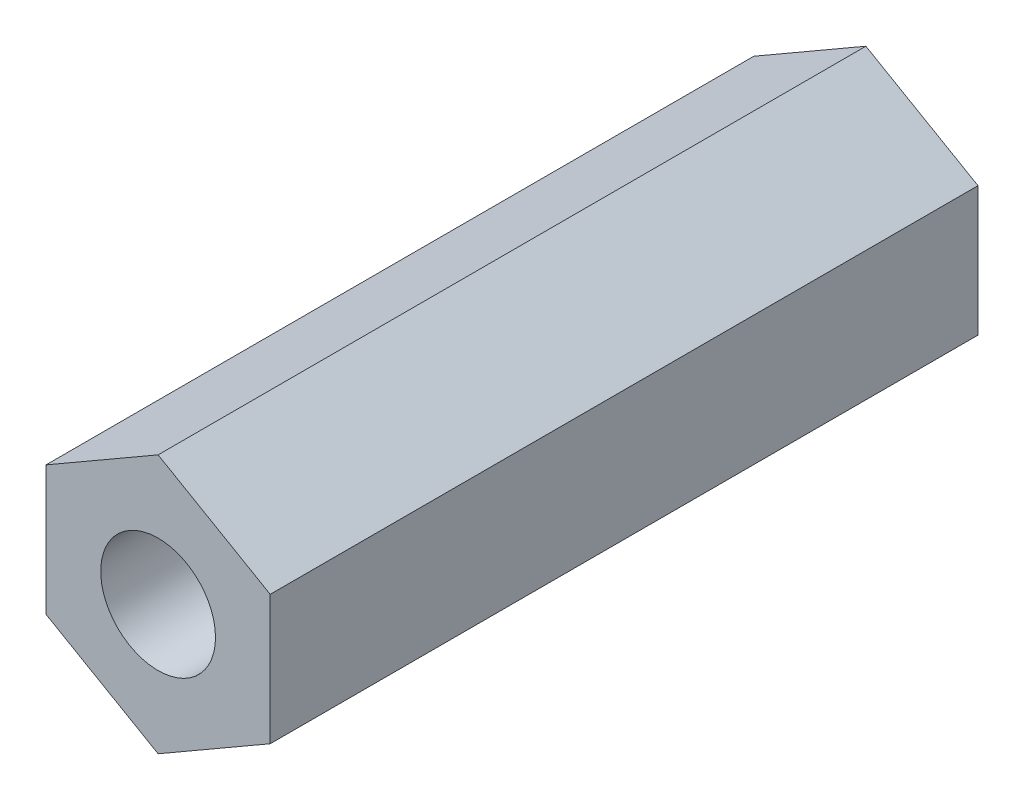
ISO-10303-21;
HEADER;
FILE_DESCRIPTION(('STEP AP214'),'2;1');
FILE_NAME('part.step','',(''),(''),'','','');
FILE_SCHEMA(('AUTOMOTIVE_DESIGN { 1 0 10303 214 1 1 1 1 }'));
ENDSEC;
DATA;
#1=APPLICATION_CONTEXT('core data for automotive mechanical design processes');
#2=APPLICATION_PROTOCOL_DEFINITION('international standard','automotive_design',2000,#1);
#3=PRODUCT_CONTEXT('',#1,'mechanical');
#4=PRODUCT('Part','Part','',(#3));
#5=PRODUCT_RELATED_PRODUCT_CATEGORY('part','',(#4));
#6=PRODUCT_DEFINITION_FORMATION('','',#4);
#7=PRODUCT_DEFINITION_CONTEXT('part definition',#1,'design');
#8=PRODUCT_DEFINITION('design','',#6,#7);
#9=PRODUCT_DEFINITION_SHAPE('','',#8);
#10=(LENGTH_UNIT() NAMED_UNIT(*) SI_UNIT(.MILLI.,.METRE.));
#11=(NAMED_UNIT(*) PLANE_ANGLE_UNIT() SI_UNIT($,.RADIAN.));
#12=(NAMED_UNIT(*) SI_UNIT($,.STERADIAN.) SOLID_ANGLE_UNIT());
#13=UNCERTAINTY_MEASURE_WITH_UNIT(LENGTH_MEASURE(1.E-05),#10,'distance_accuracy_value','');
#14=(GEOMETRIC_REPRESENTATION_CONTEXT(3) GLOBAL_UNCERTAINTY_ASSIGNED_CONTEXT((#13)) GLOBAL_UNIT_ASSIGNED_CONTEXT((#10,
#11,#12)) REPRESENTATION_CONTEXT('',''));
#15=CARTESIAN_POINT('',(0.,0.,0.));
#16=DIRECTION('',(0.,0.,1.));
#17=DIRECTION('',(1.,0.,0.));
#18=AXIS2_PLACEMENT_3D('',#15,#16,#17);
#19=CARTESIAN_POINT('',(0.,0.,18.5));
#20=DIRECTION('',(0.,0.,1.));
#21=DIRECTION('',(1.,0.,0.));
#22=AXIS2_PLACEMENT_3D('',#19,#20,#21);
#23=PLANE('',#22);
#24=DIRECTION('',(0.866025403784439,-0.5,0.));
#25=VECTOR('',#24,1.);
#26=CARTESIAN_POINT('',(-2.93,-1.6916362887256,18.5));
#27=LINE('',#26,#25);
#28=CARTESIAN_POINT('',(-2.93,-1.6916362887256,18.5));
#29=VERTEX_POINT('',#28);
#30=CARTESIAN_POINT('',(0.,-3.38327257745121,18.5));
#31=VERTEX_POINT('',#30);
#32=EDGE_CURVE('E133',#29,#31,#27,.T.);
#33=ORIENTED_EDGE('',*,*,#32,.T.);
#34=DIRECTION('',(0.866025403784439,0.5,0.));
#35=VECTOR('',#34,1.);
#36=CARTESIAN_POINT('',(0.,-3.38327257745121,18.5));
#37=LINE('',#36,#35);
#38=CARTESIAN_POINT('',(2.93,-1.6916362887256,18.5));
#39=VERTEX_POINT('',#38);
#40=EDGE_CURVE('E91',#31,#39,#37,.T.);
#41=ORIENTED_EDGE('',*,*,#40,.T.);
#42=DIRECTION('',(0.,1.,0.));
#43=VECTOR('',#42,1.);
#44=CARTESIAN_POINT('',(2.93,-1.6916362887256,18.5));
#45=LINE('',#44,#43);
#46=CARTESIAN_POINT('',(2.93,1.69163628872561,18.5));
#47=VERTEX_POINT('',#46);
#48=EDGE_CURVE('E104',#39,#47,#45,.T.);
#49=ORIENTED_EDGE('',*,*,#48,.T.);
#50=DIRECTION('',(-0.866025403784439,0.5,0.));
#51=VECTOR('',#50,1.);
#52=CARTESIAN_POINT('',(2.93,1.69163628872561,18.5));
#53=LINE('',#52,#51);
#54=CARTESIAN_POINT('',(0.,3.38327257745121,18.5));
#55=VERTEX_POINT('',#54);
#56=EDGE_CURVE('E98',#47,#55,#53,.T.);
#57=ORIENTED_EDGE('',*,*,#56,.T.);
#58=DIRECTION('',(-0.866025403784439,-0.5,0.));
#59=VECTOR('',#58,1.);
#60=CARTESIAN_POINT('',(0.,3.38327257745121,18.5));
#61=LINE('',#60,#59);
#62=CARTESIAN_POINT('',(-2.93,1.6916362887256,18.5));
#63=VERTEX_POINT('',#62);
#64=EDGE_CURVE('E102',#55,#63,#61,.T.);
#65=ORIENTED_EDGE('',*,*,#64,.T.);
#66=DIRECTION('',(0.,-1.,0.));
#67=VECTOR('',#66,1.);
#68=CARTESIAN_POINT('',(-2.93,1.6916362887256,18.5));
#69=LINE('',#68,#67);
#70=EDGE_CURVE('E54',#63,#29,#69,.T.);
#71=ORIENTED_EDGE('',*,*,#70,.T.);
#72=EDGE_LOOP('',(#33,#41,#49,#57,#65,#71));
#73=FACE_BOUND('',#72,.T.);
#74=CARTESIAN_POINT('',(0.,0.,18.5));
#75=DIRECTION('',(0.,0.,1.));
#76=DIRECTION('',(1.,0.,0.));
#77=AXIS2_PLACEMENT_3D('',#74,#75,#76);
#78=CIRCLE('',#77,1.5);
#79=CARTESIAN_POINT('',(1.5,0.,18.5));
#80=VERTEX_POINT('',#79);
#81=EDGE_CURVE('E126',#80,#80,#78,.T.);
#82=ORIENTED_EDGE('',*,*,#81,.F.);
#83=EDGE_LOOP('',(#82));
#84=FACE_BOUND('',#83,.T.);
#85=ADVANCED_FACE('F37',(#73,#84),#23,.T.);
#86=CARTESIAN_POINT('',(0.,0.,0.));
#87=DIRECTION('',(0.,0.,1.));
#88=DIRECTION('',(1.,0.,0.));
#89=AXIS2_PLACEMENT_3D('',#86,#87,#88);
#90=PLANE('',#89);
#91=DIRECTION('',(0.866025403784439,-0.5,0.));
#92=VECTOR('',#91,1.);
#93=CARTESIAN_POINT('',(-2.93,-1.6916362887256,0.));
#94=LINE('',#93,#92);
#95=CARTESIAN_POINT('',(-2.93,-1.6916362887256,0.));
#96=VERTEX_POINT('',#95);
#97=CARTESIAN_POINT('',(0.,-3.38327257745121,0.));
#98=VERTEX_POINT('',#97);
#99=EDGE_CURVE('E122',#96,#98,#94,.T.);
#100=ORIENTED_EDGE('',*,*,#99,.F.);
#101=DIRECTION('',(0.,-1.,0.));
#102=VECTOR('',#101,1.);
#103=CARTESIAN_POINT('',(-2.93,1.6916362887256,0.));
#104=LINE('',#103,#102);
#105=CARTESIAN_POINT('',(-2.93,1.6916362887256,0.));
#106=VERTEX_POINT('',#105);
#107=EDGE_CURVE('E83',#106,#96,#104,.T.);
#108=ORIENTED_EDGE('',*,*,#107,.F.);
#109=DIRECTION('',(-0.866025403784439,-0.5,0.));
#110=VECTOR('',#109,1.);
#111=CARTESIAN_POINT('',(0.,3.38327257745121,0.));
#112=LINE('',#111,#110);
#113=CARTESIAN_POINT('',(0.,3.38327257745121,0.));
#114=VERTEX_POINT('',#113);
#115=EDGE_CURVE('E77',#114,#106,#112,.T.);
#116=ORIENTED_EDGE('',*,*,#115,.F.);
#117=DIRECTION('',(-0.866025403784439,0.5,0.));
#118=VECTOR('',#117,1.);
#119=CARTESIAN_POINT('',(2.93,1.69163628872561,0.));
#120=LINE('',#119,#118);
#121=CARTESIAN_POINT('',(2.93,1.69163628872561,0.));
#122=VERTEX_POINT('',#121);
#123=EDGE_CURVE('E112',#122,#114,#120,.T.);
#124=ORIENTED_EDGE('',*,*,#123,.F.);
#125=DIRECTION('',(0.,1.,0.));
#126=VECTOR('',#125,1.);
#127=CARTESIAN_POINT('',(2.93,-1.6916362887256,0.));
#128=LINE('',#127,#126);
#129=CARTESIAN_POINT('',(2.93,-1.6916362887256,0.));
#130=VERTEX_POINT('',#129);
#131=EDGE_CURVE('E128',#130,#122,#128,.T.);
#132=ORIENTED_EDGE('',*,*,#131,.F.);
#133=DIRECTION('',(0.866025403784439,0.5,0.));
#134=VECTOR('',#133,1.);
#135=CARTESIAN_POINT('',(0.,-3.38327257745121,0.));
#136=LINE('',#135,#134);
#137=EDGE_CURVE('E125',#98,#130,#136,.T.);
#138=ORIENTED_EDGE('',*,*,#137,.F.);
#139=EDGE_LOOP('',(#100,#108,#116,#124,#132,#138));
#140=FACE_BOUND('',#139,.T.);
#141=CARTESIAN_POINT('',(0.,0.,0.));
#142=DIRECTION('',(0.,0.,1.));
#143=DIRECTION('',(1.,0.,0.));
#144=AXIS2_PLACEMENT_3D('',#141,#142,#143);
#145=CIRCLE('',#144,1.5);
#146=CARTESIAN_POINT('',(1.5,0.,0.));
#147=VERTEX_POINT('',#146);
#148=EDGE_CURVE('E226',#147,#147,#145,.T.);
#149=ORIENTED_EDGE('',*,*,#148,.T.);
#150=EDGE_LOOP('',(#149));
#151=FACE_BOUND('',#150,.T.);
#152=ADVANCED_FACE('F142',(#140,#151),#90,.F.);
#153=CARTESIAN_POINT('',(-2.93,-1.6916362887256,18.5));
#154=DIRECTION('',(0.5,0.866025403784439,0.));
#155=DIRECTION('',(-0.866025403784439,0.5,0.));
#156=AXIS2_PLACEMENT_3D('',#153,#154,#155);
#157=PLANE('',#156);
#158=ORIENTED_EDGE('',*,*,#99,.T.);
#159=DIRECTION('',(0.,0.,-1.));
#160=VECTOR('',#159,1.);
#161=CARTESIAN_POINT('',(0.,-3.38327257745121,18.5));
#162=LINE('',#161,#160);
#163=EDGE_CURVE('E11',#31,#98,#162,.T.);
#164=ORIENTED_EDGE('',*,*,#163,.F.);
#165=ORIENTED_EDGE('',*,*,#32,.F.);
#166=DIRECTION('',(0.,0.,-1.));
#167=VECTOR('',#166,1.);
#168=CARTESIAN_POINT('',(-2.93,-1.6916362887256,18.5));
#169=LINE('',#168,#167);
#170=EDGE_CURVE('E118',#29,#96,#169,.T.);
#171=ORIENTED_EDGE('',*,*,#170,.T.);
#172=EDGE_LOOP('',(#158,#164,#165,#171));
#173=FACE_BOUND('',#172,.T.);
#174=ADVANCED_FACE('F39',(#173),#157,.F.);
#175=CARTESIAN_POINT('',(0.,-3.38327257745121,18.5));
#176=DIRECTION('',(-0.5,0.866025403784438,0.));
#177=DIRECTION('',(-0.866025403784438,-0.5,0.));
#178=AXIS2_PLACEMENT_3D('',#175,#176,#177);
#179=PLANE('',#178);
#180=ORIENTED_EDGE('',*,*,#137,.T.);
#181=DIRECTION('',(0.,0.,-1.));
#182=VECTOR('',#181,1.);
#183=CARTESIAN_POINT('',(2.93,-1.6916362887256,18.5));
#184=LINE('',#183,#182);
#185=EDGE_CURVE('E46',#39,#130,#184,.T.);
#186=ORIENTED_EDGE('',*,*,#185,.F.);
#187=ORIENTED_EDGE('',*,*,#40,.F.);
#188=ORIENTED_EDGE('',*,*,#163,.T.);
#189=EDGE_LOOP('',(#180,#186,#187,#188));
#190=FACE_BOUND('',#189,.T.);
#191=ADVANCED_FACE('F167',(#190),#179,.F.);
#192=CARTESIAN_POINT('',(2.93,-1.6916362887256,18.5));
#193=DIRECTION('',(-1.,0.,0.));
#194=DIRECTION('',(0.,0.,1.));
#195=AXIS2_PLACEMENT_3D('',#192,#193,#194);
#196=PLANE('',#195);
#197=ORIENTED_EDGE('',*,*,#131,.T.);
#198=DIRECTION('',(0.,0.,-1.));
#199=VECTOR('',#198,1.);
#200=CARTESIAN_POINT('',(2.93,1.69163628872561,18.5));
#201=LINE('',#200,#199);
#202=EDGE_CURVE('E113',#47,#122,#201,.T.);
#203=ORIENTED_EDGE('',*,*,#202,.F.);
#204=ORIENTED_EDGE('',*,*,#48,.F.);
#205=ORIENTED_EDGE('',*,*,#185,.T.);
#206=EDGE_LOOP('',(#197,#203,#204,#205));
#207=FACE_BOUND('',#206,.T.);
#208=ADVANCED_FACE('F139',(#207),#196,.F.);
#209=CARTESIAN_POINT('',(2.93,1.69163628872561,18.5));
#210=DIRECTION('',(-0.5,-0.866025403784439,0.));
#211=DIRECTION('',(0.866025403784439,-0.5,0.));
#212=AXIS2_PLACEMENT_3D('',#209,#210,#211);
#213=PLANE('',#212);
#214=ORIENTED_EDGE('',*,*,#123,.T.);
#215=DIRECTION('',(0.,0.,-1.));
#216=VECTOR('',#215,1.);
#217=CARTESIAN_POINT('',(0.,3.38327257745121,18.5));
#218=LINE('',#217,#216);
#219=EDGE_CURVE('E109',#55,#114,#218,.T.);
#220=ORIENTED_EDGE('',*,*,#219,.F.);
#221=ORIENTED_EDGE('',*,*,#56,.F.);
#222=ORIENTED_EDGE('',*,*,#202,.T.);
#223=EDGE_LOOP('',(#214,#220,#221,#222));
#224=FACE_BOUND('',#223,.T.);
#225=ADVANCED_FACE('F110',(#224),#213,.F.);
#226=CARTESIAN_POINT('',(0.,3.38327257745121,18.5));
#227=DIRECTION('',(0.5,-0.866025403784438,0.));
#228=DIRECTION('',(0.866025403784439,0.5,0.));
#229=AXIS2_PLACEMENT_3D('',#226,#227,#228);
#230=PLANE('',#229);
#231=ORIENTED_EDGE('',*,*,#115,.T.);
#232=DIRECTION('',(0.,0.,-1.));
#233=VECTOR('',#232,1.);
#234=CARTESIAN_POINT('',(-2.93,1.6916362887256,18.5));
#235=LINE('',#234,#233);
#236=EDGE_CURVE('E114',#63,#106,#235,.T.);
#237=ORIENTED_EDGE('',*,*,#236,.F.);
#238=ORIENTED_EDGE('',*,*,#64,.F.);
#239=ORIENTED_EDGE('',*,*,#219,.T.);
#240=EDGE_LOOP('',(#231,#237,#238,#239));
#241=FACE_BOUND('',#240,.T.);
#242=ADVANCED_FACE('F116',(#241),#230,.F.);
#243=CARTESIAN_POINT('',(-2.93,1.6916362887256,18.5));
#244=DIRECTION('',(1.,0.,0.));
#245=DIRECTION('',(0.,0.,-1.));
#246=AXIS2_PLACEMENT_3D('',#243,#244,#245);
#247=PLANE('',#246);
#248=ORIENTED_EDGE('',*,*,#107,.T.);
#249=ORIENTED_EDGE('',*,*,#170,.F.);
#250=ORIENTED_EDGE('',*,*,#70,.F.);
#251=ORIENTED_EDGE('',*,*,#236,.T.);
#252=EDGE_LOOP('',(#248,#249,#250,#251));
#253=FACE_BOUND('',#252,.T.);
#254=ADVANCED_FACE('F147',(#253),#247,.F.);
#255=CARTESIAN_POINT('',(0.,0.,18.5));
#256=DIRECTION('',(0.,0.,-1.));
#257=DIRECTION('',(-1.,0.,0.));
#258=AXIS2_PLACEMENT_3D('',#255,#256,#257);
#259=CYLINDRICAL_SURFACE('',#258,1.5);
#260=ORIENTED_EDGE('',*,*,#81,.T.);
#261=EDGE_LOOP('',(#260));
#262=FACE_BOUND('',#261,.T.);
#263=ORIENTED_EDGE('',*,*,#148,.F.);
#264=EDGE_LOOP('',(#263));
#265=FACE_BOUND('',#264,.T.);
#266=ADVANCED_FACE('F149',(#262,#265),#259,.F.);
#267=CLOSED_SHELL('',(#85,#152,#174,#191,#208,#225,#242,#254,#266));
#268=MANIFOLD_SOLID_BREP('B2',#267);
#269=ADVANCED_BREP_SHAPE_REPRESENTATION('',(#18,#268),#14);
#270=SHAPE_DEFINITION_REPRESENTATION(#9,#269);
ENDSEC;
END-ISO-10303-21;
